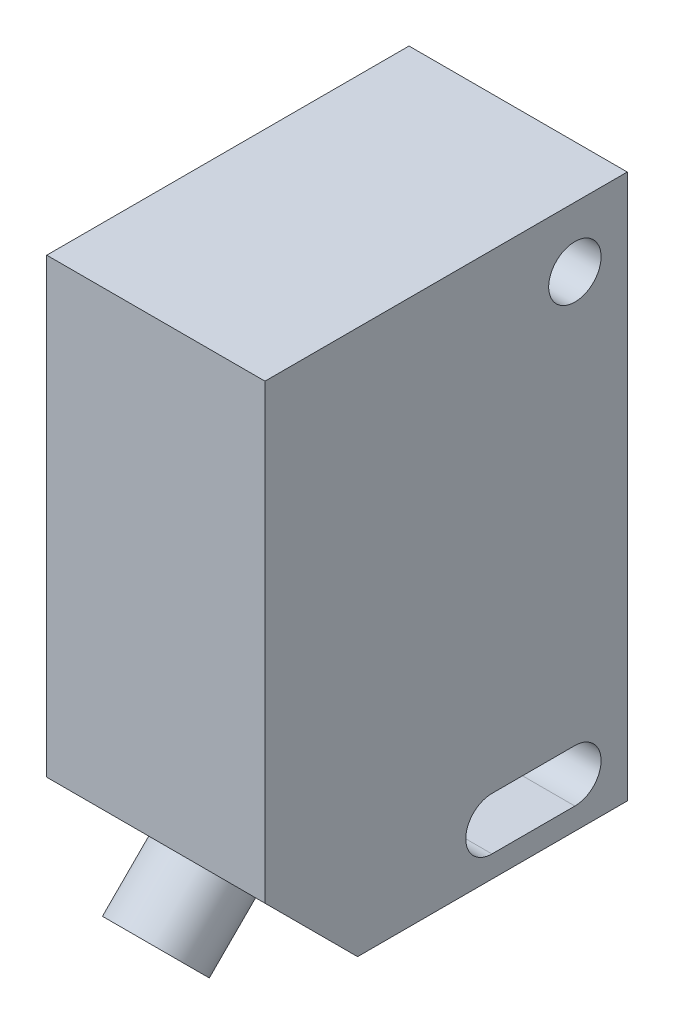
ISO-10303-21;
HEADER;
FILE_DESCRIPTION(('STEP AP214'),'2;1');
FILE_NAME('part.step','',(''),(''),'','','');
FILE_SCHEMA(('AUTOMOTIVE_DESIGN { 1 0 10303 214 1 1 1 1 }'));
ENDSEC;
DATA;
#1=APPLICATION_CONTEXT('core data for automotive mechanical design processes');
#2=APPLICATION_PROTOCOL_DEFINITION('international standard','automotive_design',2000,#1);
#3=PRODUCT_CONTEXT('',#1,'mechanical');
#4=PRODUCT('Part','Part','',(#3));
#5=PRODUCT_RELATED_PRODUCT_CATEGORY('part','',(#4));
#6=PRODUCT_DEFINITION_FORMATION('','',#4);
#7=PRODUCT_DEFINITION_CONTEXT('part definition',#1,'design');
#8=PRODUCT_DEFINITION('design','',#6,#7);
#9=PRODUCT_DEFINITION_SHAPE('','',#8);
#10=(LENGTH_UNIT() NAMED_UNIT(*) SI_UNIT(.MILLI.,.METRE.));
#11=(NAMED_UNIT(*) PLANE_ANGLE_UNIT() SI_UNIT($,.RADIAN.));
#12=(NAMED_UNIT(*) SI_UNIT($,.STERADIAN.) SOLID_ANGLE_UNIT());
#13=UNCERTAINTY_MEASURE_WITH_UNIT(LENGTH_MEASURE(1.E-05),#10,'distance_accuracy_value','');
#14=(GEOMETRIC_REPRESENTATION_CONTEXT(3) GLOBAL_UNCERTAINTY_ASSIGNED_CONTEXT((#13)) GLOBAL_UNIT_ASSIGNED_CONTEXT((#10,
#11,#12)) REPRESENTATION_CONTEXT('',''));
#15=CARTESIAN_POINT('',(0.,0.,0.));
#16=DIRECTION('',(0.,0.,1.));
#17=DIRECTION('',(1.,0.,0.));
#18=AXIS2_PLACEMENT_3D('',#15,#16,#17);
#19=CARTESIAN_POINT('',(12.7,0.,0.));
#20=DIRECTION('',(-1.,0.,0.));
#21=DIRECTION('',(0.,0.,1.));
#22=AXIS2_PLACEMENT_3D('',#19,#20,#21);
#23=PLANE('',#22);
#24=DIRECTION('',(0.,1.,0.));
#25=VECTOR('',#24,1.);
#26=CARTESIAN_POINT('',(12.7,0.,0.));
#27=LINE('',#26,#25);
#28=CARTESIAN_POINT('',(12.7,0.,0.));
#29=VERTEX_POINT('',#28);
#30=CARTESIAN_POINT('',(12.7,31.7,0.));
#31=VERTEX_POINT('',#30);
#32=EDGE_CURVE('E145',#29,#31,#27,.T.);
#33=ORIENTED_EDGE('',*,*,#32,.T.);
#34=DIRECTION('',(0.,0.,1.));
#35=VECTOR('',#34,1.);
#36=CARTESIAN_POINT('',(12.7,31.7,21.082));
#37=LINE('',#36,#35);
#38=CARTESIAN_POINT('',(12.7,31.7,21.082));
#39=VERTEX_POINT('',#38);
#40=EDGE_CURVE('E148',#31,#39,#37,.T.);
#41=ORIENTED_EDGE('',*,*,#40,.T.);
#42=DIRECTION('',(0.,-1.,0.));
#43=VECTOR('',#42,1.);
#44=CARTESIAN_POINT('',(12.7,5.3881536726415,21.082));
#45=LINE('',#44,#43);
#46=CARTESIAN_POINT('',(12.7,5.3881536726415,21.082));
#47=VERTEX_POINT('',#46);
#48=EDGE_CURVE('E151',#39,#47,#45,.T.);
#49=ORIENTED_EDGE('',*,*,#48,.T.);
#50=DIRECTION('',(0.,-0.707106781186549,-0.707106781186546));
#51=VECTOR('',#50,1.);
#52=CARTESIAN_POINT('',(12.7,5.3881536726415,21.082));
#53=LINE('',#52,#51);
#54=CARTESIAN_POINT('',(12.7,0.,15.6938463273585));
#55=VERTEX_POINT('',#54);
#56=EDGE_CURVE('E153',#47,#55,#53,.T.);
#57=ORIENTED_EDGE('',*,*,#56,.T.);
#58=DIRECTION('',(0.,0.,-1.));
#59=VECTOR('',#58,1.);
#60=CARTESIAN_POINT('',(12.7,0.,15.6938463273585));
#61=LINE('',#60,#59);
#62=EDGE_CURVE('E155',#55,#29,#61,.T.);
#63=ORIENTED_EDGE('',*,*,#62,.T.);
#64=EDGE_LOOP('',(#33,#41,#49,#57,#63));
#65=FACE_BOUND('',#64,.T.);
#66=CARTESIAN_POINT('',(12.7,2.794,7.874));
#67=DIRECTION('',(1.,0.,0.));
#68=DIRECTION('',(0.,0.,-1.));
#69=AXIS2_PLACEMENT_3D('',#66,#67,#68);
#70=CIRCLE('',#69,1.524);
#71=CARTESIAN_POINT('',(12.7,4.318,7.874));
#72=VERTEX_POINT('',#71);
#73=CARTESIAN_POINT('',(12.7,1.27,7.874));
#74=VERTEX_POINT('',#73);
#75=EDGE_CURVE('E106',#72,#74,#70,.T.);
#76=ORIENTED_EDGE('',*,*,#75,.F.);
#77=DIRECTION('',(0.,0.,1.));
#78=VECTOR('',#77,1.);
#79=CARTESIAN_POINT('',(12.7,4.318,7.874));
#80=LINE('',#79,#78);
#81=CARTESIAN_POINT('',(12.7,4.318,3.048));
#82=VERTEX_POINT('',#81);
#83=EDGE_CURVE('E129',#82,#72,#80,.T.);
#84=ORIENTED_EDGE('',*,*,#83,.F.);
#85=CARTESIAN_POINT('',(12.7,2.794,3.048));
#86=DIRECTION('',(1.,0.,0.));
#87=DIRECTION('',(0.,0.,-1.));
#88=AXIS2_PLACEMENT_3D('',#85,#86,#87);
#89=CIRCLE('',#88,1.524);
#90=CARTESIAN_POINT('',(12.7,1.27,3.048));
#91=VERTEX_POINT('',#90);
#92=EDGE_CURVE('E127',#91,#82,#89,.T.);
#93=ORIENTED_EDGE('',*,*,#92,.F.);
#94=DIRECTION('',(0.,0.,-1.));
#95=VECTOR('',#94,1.);
#96=CARTESIAN_POINT('',(12.7,1.27,7.874));
#97=LINE('',#96,#95);
#98=EDGE_CURVE('E114',#74,#91,#97,.T.);
#99=ORIENTED_EDGE('',*,*,#98,.F.);
#100=EDGE_LOOP('',(#76,#84,#93,#99));
#101=FACE_BOUND('',#100,.T.);
#102=CARTESIAN_POINT('',(12.7,28.194,3.048));
#103=DIRECTION('',(1.,0.,0.));
#104=DIRECTION('',(0.,0.,-1.));
#105=AXIS2_PLACEMENT_3D('',#102,#103,#104);
#106=CIRCLE('',#105,1.524);
#107=CARTESIAN_POINT('',(12.7,28.194,1.524));
#108=VERTEX_POINT('',#107);
#109=EDGE_CURVE('E135',#108,#108,#106,.T.);
#110=ORIENTED_EDGE('',*,*,#109,.F.);
#111=EDGE_LOOP('',(#110));
#112=FACE_BOUND('',#111,.T.);
#113=ADVANCED_FACE('F34',(#65,#101,#112),#23,.F.);
#114=CARTESIAN_POINT('',(0.,0.,0.));
#115=DIRECTION('',(-1.,0.,0.));
#116=DIRECTION('',(0.,0.,1.));
#117=AXIS2_PLACEMENT_3D('',#114,#115,#116);
#118=PLANE('',#117);
#119=DIRECTION('',(0.,0.,1.));
#120=VECTOR('',#119,1.);
#121=CARTESIAN_POINT('',(0.,4.318,7.874));
#122=LINE('',#121,#120);
#123=CARTESIAN_POINT('',(0.,4.318,3.048));
#124=VERTEX_POINT('',#123);
#125=CARTESIAN_POINT('',(0.,4.318,7.874));
#126=VERTEX_POINT('',#125);
#127=EDGE_CURVE('E115',#124,#126,#122,.T.);
#128=ORIENTED_EDGE('',*,*,#127,.T.);
#129=CARTESIAN_POINT('',(0.,2.794,7.874));
#130=DIRECTION('',(1.,0.,0.));
#131=DIRECTION('',(0.,0.,-1.));
#132=AXIS2_PLACEMENT_3D('',#129,#130,#131);
#133=CIRCLE('',#132,1.524);
#134=CARTESIAN_POINT('',(0.,1.27,7.874));
#135=VERTEX_POINT('',#134);
#136=EDGE_CURVE('E58',#126,#135,#133,.T.);
#137=ORIENTED_EDGE('',*,*,#136,.T.);
#138=DIRECTION('',(0.,0.,-1.));
#139=VECTOR('',#138,1.);
#140=CARTESIAN_POINT('',(0.,1.27,7.874));
#141=LINE('',#140,#139);
#142=CARTESIAN_POINT('',(0.,1.27,3.048));
#143=VERTEX_POINT('',#142);
#144=EDGE_CURVE('E121',#135,#143,#141,.T.);
#145=ORIENTED_EDGE('',*,*,#144,.T.);
#146=CARTESIAN_POINT('',(0.,2.794,3.048));
#147=DIRECTION('',(1.,0.,0.));
#148=DIRECTION('',(0.,0.,-1.));
#149=AXIS2_PLACEMENT_3D('',#146,#147,#148);
#150=CIRCLE('',#149,1.524);
#151=EDGE_CURVE('E137',#143,#124,#150,.T.);
#152=ORIENTED_EDGE('',*,*,#151,.T.);
#153=EDGE_LOOP('',(#128,#137,#145,#152));
#154=FACE_BOUND('',#153,.T.);
#155=DIRECTION('',(0.,1.,0.));
#156=VECTOR('',#155,1.);
#157=CARTESIAN_POINT('',(0.,0.,0.));
#158=LINE('',#157,#156);
#159=CARTESIAN_POINT('',(0.,0.,0.));
#160=VERTEX_POINT('',#159);
#161=CARTESIAN_POINT('',(0.,31.7,0.));
#162=VERTEX_POINT('',#161);
#163=EDGE_CURVE('E122',#160,#162,#158,.T.);
#164=ORIENTED_EDGE('',*,*,#163,.F.);
#165=DIRECTION('',(0.,0.,-1.));
#166=VECTOR('',#165,1.);
#167=CARTESIAN_POINT('',(0.,0.,15.6938463273585));
#168=LINE('',#167,#166);
#169=CARTESIAN_POINT('',(0.,0.,15.6938463273585));
#170=VERTEX_POINT('',#169);
#171=EDGE_CURVE('E149',#170,#160,#168,.T.);
#172=ORIENTED_EDGE('',*,*,#171,.F.);
#173=DIRECTION('',(0.,-0.707106781186549,-0.707106781186546));
#174=VECTOR('',#173,1.);
#175=CARTESIAN_POINT('',(0.,5.3881536726415,21.082));
#176=LINE('',#175,#174);
#177=CARTESIAN_POINT('',(0.,5.3881536726415,21.082));
#178=VERTEX_POINT('',#177);
#179=EDGE_CURVE('E164',#178,#170,#176,.T.);
#180=ORIENTED_EDGE('',*,*,#179,.F.);
#181=DIRECTION('',(0.,-1.,0.));
#182=VECTOR('',#181,1.);
#183=CARTESIAN_POINT('',(0.,5.3881536726415,21.082));
#184=LINE('',#183,#182);
#185=CARTESIAN_POINT('',(0.,31.7,21.082));
#186=VERTEX_POINT('',#185);
#187=EDGE_CURVE('E162',#186,#178,#184,.T.);
#188=ORIENTED_EDGE('',*,*,#187,.F.);
#189=DIRECTION('',(0.,0.,1.));
#190=VECTOR('',#189,1.);
#191=CARTESIAN_POINT('',(0.,31.7,21.082));
#192=LINE('',#191,#190);
#193=EDGE_CURVE('E160',#162,#186,#192,.T.);
#194=ORIENTED_EDGE('',*,*,#193,.F.);
#195=EDGE_LOOP('',(#164,#172,#180,#188,#194));
#196=FACE_BOUND('',#195,.T.);
#197=CARTESIAN_POINT('',(0.,28.194,3.048));
#198=DIRECTION('',(1.,0.,0.));
#199=DIRECTION('',(0.,0.,-1.));
#200=AXIS2_PLACEMENT_3D('',#197,#198,#199);
#201=CIRCLE('',#200,1.524);
#202=CARTESIAN_POINT('',(0.,28.194,1.524));
#203=VERTEX_POINT('',#202);
#204=EDGE_CURVE('E245',#203,#203,#201,.T.);
#205=ORIENTED_EDGE('',*,*,#204,.T.);
#206=EDGE_LOOP('',(#205));
#207=FACE_BOUND('',#206,.T.);
#208=ADVANCED_FACE('F190',(#154,#196,#207),#118,.T.);
#209=CARTESIAN_POINT('',(12.7,0.,0.));
#210=DIRECTION('',(0.,0.,1.));
#211=DIRECTION('',(1.,0.,0.));
#212=AXIS2_PLACEMENT_3D('',#209,#210,#211);
#213=PLANE('',#212);
#214=ORIENTED_EDGE('',*,*,#163,.T.);
#215=DIRECTION('',(-1.,0.,0.));
#216=VECTOR('',#215,1.);
#217=CARTESIAN_POINT('',(12.7,31.7,0.));
#218=LINE('',#217,#216);
#219=EDGE_CURVE('E38',#31,#162,#218,.T.);
#220=ORIENTED_EDGE('',*,*,#219,.F.);
#221=ORIENTED_EDGE('',*,*,#32,.F.);
#222=DIRECTION('',(-1.,0.,0.));
#223=VECTOR('',#222,1.);
#224=CARTESIAN_POINT('',(12.7,0.,0.));
#225=LINE('',#224,#223);
#226=EDGE_CURVE('E157',#29,#160,#225,.T.);
#227=ORIENTED_EDGE('',*,*,#226,.T.);
#228=EDGE_LOOP('',(#214,#220,#221,#227));
#229=FACE_BOUND('',#228,.T.);
#230=ADVANCED_FACE('F36',(#229),#213,.F.);
#231=CARTESIAN_POINT('',(12.7,31.7,21.082));
#232=DIRECTION('',(0.,-1.,0.));
#233=DIRECTION('',(0.,0.,-1.));
#234=AXIS2_PLACEMENT_3D('',#231,#232,#233);
#235=PLANE('',#234);
#236=ORIENTED_EDGE('',*,*,#193,.T.);
#237=DIRECTION('',(-1.,0.,0.));
#238=VECTOR('',#237,1.);
#239=CARTESIAN_POINT('',(12.7,31.7,21.082));
#240=LINE('',#239,#238);
#241=EDGE_CURVE('E174',#39,#186,#240,.T.);
#242=ORIENTED_EDGE('',*,*,#241,.F.);
#243=ORIENTED_EDGE('',*,*,#40,.F.);
#244=ORIENTED_EDGE('',*,*,#219,.T.);
#245=EDGE_LOOP('',(#236,#242,#243,#244));
#246=FACE_BOUND('',#245,.T.);
#247=ADVANCED_FACE('F183',(#246),#235,.F.);
#248=CARTESIAN_POINT('',(12.7,5.3881536726415,21.082));
#249=DIRECTION('',(0.,0.,-1.));
#250=DIRECTION('',(-1.,0.,0.));
#251=AXIS2_PLACEMENT_3D('',#248,#249,#250);
#252=PLANE('',#251);
#253=ORIENTED_EDGE('',*,*,#187,.T.);
#254=DIRECTION('',(-1.,0.,0.));
#255=VECTOR('',#254,1.);
#256=CARTESIAN_POINT('',(12.7,5.3881536726415,21.082));
#257=LINE('',#256,#255);
#258=EDGE_CURVE('E172',#47,#178,#257,.T.);
#259=ORIENTED_EDGE('',*,*,#258,.F.);
#260=ORIENTED_EDGE('',*,*,#48,.F.);
#261=ORIENTED_EDGE('',*,*,#241,.T.);
#262=EDGE_LOOP('',(#253,#259,#260,#261));
#263=FACE_BOUND('',#262,.T.);
#264=ADVANCED_FACE('F194',(#263),#252,.F.);
#265=CARTESIAN_POINT('',(12.7,5.3881536726415,21.082));
#266=DIRECTION('',(0.,0.707106781186546,-0.707106781186549));
#267=DIRECTION('',(0.,0.707106781186549,0.707106781186546));
#268=AXIS2_PLACEMENT_3D('',#265,#266,#267);
#269=PLANE('',#268);
#270=CARTESIAN_POINT('',(6.35,2.69407683632075,18.3879231636793));
#271=DIRECTION('',(0.,-0.707106781186546,0.707106781186549));
#272=DIRECTION('',(0.,-0.707106781186549,-0.707106781186546));
#273=AXIS2_PLACEMENT_3D('',#270,#271,#272);
#274=CIRCLE('',#273,2.54);
#275=CARTESIAN_POINT('',(6.35,0.898025612106913,16.5918719394654));
#276=VERTEX_POINT('',#275);
#277=EDGE_CURVE('E11',#276,#276,#274,.T.);
#278=ORIENTED_EDGE('',*,*,#277,.F.);
#279=EDGE_LOOP('',(#278));
#280=FACE_BOUND('',#279,.T.);
#281=ORIENTED_EDGE('',*,*,#179,.T.);
#282=DIRECTION('',(-1.,0.,0.));
#283=VECTOR('',#282,1.);
#284=CARTESIAN_POINT('',(12.7,0.,15.6938463273585));
#285=LINE('',#284,#283);
#286=EDGE_CURVE('E169',#55,#170,#285,.T.);
#287=ORIENTED_EDGE('',*,*,#286,.F.);
#288=ORIENTED_EDGE('',*,*,#56,.F.);
#289=ORIENTED_EDGE('',*,*,#258,.T.);
#290=EDGE_LOOP('',(#281,#287,#288,#289));
#291=FACE_BOUND('',#290,.T.);
#292=ADVANCED_FACE('F197',(#280,#291),#269,.F.);
#293=CARTESIAN_POINT('',(12.7,0.,15.6938463273585));
#294=DIRECTION('',(0.,1.,0.));
#295=DIRECTION('',(0.,0.,1.));
#296=AXIS2_PLACEMENT_3D('',#293,#294,#295);
#297=PLANE('',#296);
#298=ORIENTED_EDGE('',*,*,#171,.T.);
#299=ORIENTED_EDGE('',*,*,#226,.F.);
#300=ORIENTED_EDGE('',*,*,#62,.F.);
#301=ORIENTED_EDGE('',*,*,#286,.T.);
#302=EDGE_LOOP('',(#298,#299,#300,#301));
#303=FACE_BOUND('',#302,.T.);
#304=ADVANCED_FACE('F202',(#303),#297,.F.);
#305=CARTESIAN_POINT('',(12.7,2.794,7.874));
#306=DIRECTION('',(-1.,0.,0.));
#307=DIRECTION('',(0.,0.,1.));
#308=AXIS2_PLACEMENT_3D('',#305,#306,#307);
#309=CYLINDRICAL_SURFACE('',#308,1.524);
#310=ORIENTED_EDGE('',*,*,#136,.F.);
#311=DIRECTION('',(-1.,0.,0.));
#312=VECTOR('',#311,1.);
#313=CARTESIAN_POINT('',(12.7,4.318,7.874));
#314=LINE('',#313,#312);
#315=EDGE_CURVE('E110',#72,#126,#314,.T.);
#316=ORIENTED_EDGE('',*,*,#315,.F.);
#317=ORIENTED_EDGE('',*,*,#75,.T.);
#318=DIRECTION('',(-1.,0.,0.));
#319=VECTOR('',#318,1.);
#320=CARTESIAN_POINT('',(12.7,1.27,7.874));
#321=LINE('',#320,#319);
#322=EDGE_CURVE('E109',#74,#135,#321,.T.);
#323=ORIENTED_EDGE('',*,*,#322,.T.);
#324=EDGE_LOOP('',(#310,#316,#317,#323));
#325=FACE_BOUND('',#324,.T.);
#326=ADVANCED_FACE('F108',(#325),#309,.F.);
#327=CARTESIAN_POINT('',(12.7,1.27,7.874));
#328=DIRECTION('',(0.,1.,0.));
#329=DIRECTION('',(0.,0.,1.));
#330=AXIS2_PLACEMENT_3D('',#327,#328,#329);
#331=PLANE('',#330);
#332=ORIENTED_EDGE('',*,*,#144,.F.);
#333=ORIENTED_EDGE('',*,*,#322,.F.);
#334=ORIENTED_EDGE('',*,*,#98,.T.);
#335=DIRECTION('',(-1.,0.,0.));
#336=VECTOR('',#335,1.);
#337=CARTESIAN_POINT('',(12.7,1.27,3.048));
#338=LINE('',#337,#336);
#339=EDGE_CURVE('E123',#91,#143,#338,.T.);
#340=ORIENTED_EDGE('',*,*,#339,.T.);
#341=EDGE_LOOP('',(#332,#333,#334,#340));
#342=FACE_BOUND('',#341,.T.);
#343=ADVANCED_FACE('F118',(#342),#331,.T.);
#344=CARTESIAN_POINT('',(12.7,2.794,3.048));
#345=DIRECTION('',(-1.,0.,0.));
#346=DIRECTION('',(0.,0.,1.));
#347=AXIS2_PLACEMENT_3D('',#344,#345,#346);
#348=CYLINDRICAL_SURFACE('',#347,1.524);
#349=ORIENTED_EDGE('',*,*,#151,.F.);
#350=ORIENTED_EDGE('',*,*,#339,.F.);
#351=ORIENTED_EDGE('',*,*,#92,.T.);
#352=DIRECTION('',(-1.,0.,0.));
#353=VECTOR('',#352,1.);
#354=CARTESIAN_POINT('',(12.7,4.318,3.048));
#355=LINE('',#354,#353);
#356=EDGE_CURVE('E50',#82,#124,#355,.T.);
#357=ORIENTED_EDGE('',*,*,#356,.T.);
#358=EDGE_LOOP('',(#349,#350,#351,#357));
#359=FACE_BOUND('',#358,.T.);
#360=ADVANCED_FACE('F222',(#359),#348,.F.);
#361=CARTESIAN_POINT('',(12.7,4.318,7.874));
#362=DIRECTION('',(0.,-1.,0.));
#363=DIRECTION('',(0.,0.,-1.));
#364=AXIS2_PLACEMENT_3D('',#361,#362,#363);
#365=PLANE('',#364);
#366=ORIENTED_EDGE('',*,*,#127,.F.);
#367=ORIENTED_EDGE('',*,*,#356,.F.);
#368=ORIENTED_EDGE('',*,*,#83,.T.);
#369=ORIENTED_EDGE('',*,*,#315,.T.);
#370=EDGE_LOOP('',(#366,#367,#368,#369));
#371=FACE_BOUND('',#370,.T.);
#372=ADVANCED_FACE('F225',(#371),#365,.T.);
#373=CARTESIAN_POINT('',(12.7,28.194,3.048));
#374=DIRECTION('',(-1.,0.,0.));
#375=DIRECTION('',(0.,0.,1.));
#376=AXIS2_PLACEMENT_3D('',#373,#374,#375);
#377=CYLINDRICAL_SURFACE('',#376,1.524);
#378=ORIENTED_EDGE('',*,*,#109,.T.);
#379=EDGE_LOOP('',(#378));
#380=FACE_BOUND('',#379,.T.);
#381=ORIENTED_EDGE('',*,*,#204,.F.);
#382=EDGE_LOOP('',(#381));
#383=FACE_BOUND('',#382,.T.);
#384=ADVANCED_FACE('F229',(#380,#383),#377,.F.);
#385=CARTESIAN_POINT('',(6.35,0.,21.082));
#386=DIRECTION('',(0.,0.707106781186546,-0.707106781186549));
#387=DIRECTION('',(0.,0.707106781186549,0.707106781186546));
#388=AXIS2_PLACEMENT_3D('',#385,#386,#387);
#389=CYLINDRICAL_SURFACE('',#388,2.54);
#390=CARTESIAN_POINT('',(6.35,0.,21.082));
#391=DIRECTION('',(0.,-0.707106781186546,0.707106781186549));
#392=DIRECTION('',(0.,-0.707106781186549,-0.707106781186546));
#393=AXIS2_PLACEMENT_3D('',#390,#391,#392);
#394=CIRCLE('',#393,2.54);
#395=CARTESIAN_POINT('',(6.35,-1.79605122421383,19.2859487757862));
#396=VERTEX_POINT('',#395);
#397=EDGE_CURVE('E244',#396,#396,#394,.T.);
#398=ORIENTED_EDGE('',*,*,#397,.F.);
#399=EDGE_LOOP('',(#398));
#400=FACE_BOUND('',#399,.T.);
#401=ORIENTED_EDGE('',*,*,#277,.T.);
#402=EDGE_LOOP('',(#401));
#403=FACE_BOUND('',#402,.T.);
#404=ADVANCED_FACE('F232',(#400,#403),#389,.T.);
#405=CARTESIAN_POINT('',(6.35,0.,21.082));
#406=DIRECTION('',(0.,-0.707106781186546,0.707106781186549));
#407=DIRECTION('',(0.,-0.707106781186549,-0.707106781186546));
#408=AXIS2_PLACEMENT_3D('',#405,#406,#407);
#409=PLANE('',#408);
#410=ORIENTED_EDGE('',*,*,#397,.T.);
#411=EDGE_LOOP('',(#410));
#412=FACE_BOUND('',#411,.T.);
#413=ADVANCED_FACE('F236',(#412),#409,.T.);
#414=CLOSED_SHELL('',(#113,#208,#230,#247,#264,#292,#304,#326,#343,#360,#372,#384,#404,#413));
#415=MANIFOLD_SOLID_BREP('B2',#414);
#416=ADVANCED_BREP_SHAPE_REPRESENTATION('',(#18,#415),#14);
#417=SHAPE_DEFINITION_REPRESENTATION(#9,#416);
ENDSEC;
END-ISO-10303-21;
